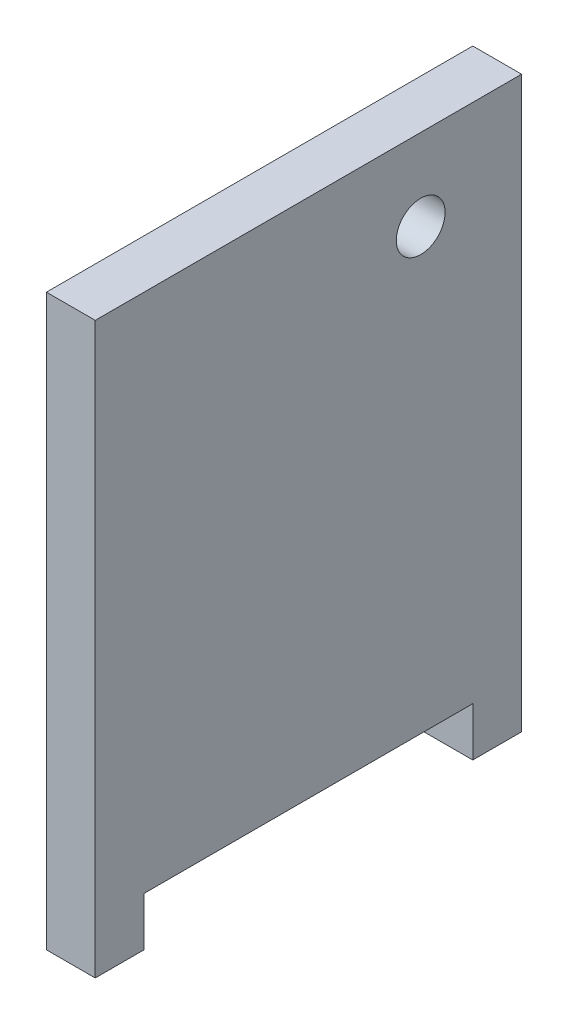
ISO-10303-21;
HEADER;
FILE_DESCRIPTION(('STEP AP214'),'2;1');
FILE_NAME('part.step','',(''),(''),'','','');
FILE_SCHEMA(('AUTOMOTIVE_DESIGN { 1 0 10303 214 1 1 1 1 }'));
ENDSEC;
DATA;
#1=APPLICATION_CONTEXT('core data for automotive mechanical design processes');
#2=APPLICATION_PROTOCOL_DEFINITION('international standard','automotive_design',2000,#1);
#3=PRODUCT_CONTEXT('',#1,'mechanical');
#4=PRODUCT('Part','Part','',(#3));
#5=PRODUCT_RELATED_PRODUCT_CATEGORY('part','',(#4));
#6=PRODUCT_DEFINITION_FORMATION('','',#4);
#7=PRODUCT_DEFINITION_CONTEXT('part definition',#1,'design');
#8=PRODUCT_DEFINITION('design','',#6,#7);
#9=PRODUCT_DEFINITION_SHAPE('','',#8);
#10=(LENGTH_UNIT() NAMED_UNIT(*) SI_UNIT(.MILLI.,.METRE.));
#11=(NAMED_UNIT(*) PLANE_ANGLE_UNIT() SI_UNIT($,.RADIAN.));
#12=(NAMED_UNIT(*) SI_UNIT($,.STERADIAN.) SOLID_ANGLE_UNIT());
#13=UNCERTAINTY_MEASURE_WITH_UNIT(LENGTH_MEASURE(1.E-05),#10,'distance_accuracy_value','');
#14=(GEOMETRIC_REPRESENTATION_CONTEXT(3) GLOBAL_UNCERTAINTY_ASSIGNED_CONTEXT((#13)) GLOBAL_UNIT_ASSIGNED_CONTEXT((#10,
#11,#12)) REPRESENTATION_CONTEXT('',''));
#15=CARTESIAN_POINT('',(0.,0.,0.));
#16=DIRECTION('',(0.,0.,1.));
#17=DIRECTION('',(1.,0.,0.));
#18=AXIS2_PLACEMENT_3D('',#15,#16,#17);
#19=CARTESIAN_POINT('',(-3.,-35.,26.2));
#20=DIRECTION('',(0.,0.,-1.));
#21=DIRECTION('',(0.,1.,0.));
#22=AXIS2_PLACEMENT_3D('',#19,#20,#21);
#23=PLANE('',#22);
#24=DIRECTION('',(0.,1.,0.));
#25=VECTOR('',#24,1.);
#26=CARTESIAN_POINT('',(0.,-35.,26.2));
#27=LINE('',#26,#25);
#28=CARTESIAN_POINT('',(0.,-35.,26.2));
#29=VERTEX_POINT('',#28);
#30=CARTESIAN_POINT('',(0.,0.,26.2));
#31=VERTEX_POINT('',#30);
#32=EDGE_CURVE('E123',#29,#31,#27,.T.);
#33=ORIENTED_EDGE('',*,*,#32,.T.);
#34=DIRECTION('',(1.,0.,0.));
#35=VECTOR('',#34,1.);
#36=CARTESIAN_POINT('',(-3.,0.,26.2));
#37=LINE('',#36,#35);
#38=CARTESIAN_POINT('',(-3.,0.,26.2));
#39=VERTEX_POINT('',#38);
#40=EDGE_CURVE('E10',#39,#31,#37,.T.);
#41=ORIENTED_EDGE('',*,*,#40,.F.);
#42=DIRECTION('',(0.,1.,0.));
#43=VECTOR('',#42,1.);
#44=CARTESIAN_POINT('',(-3.,-35.,26.2));
#45=LINE('',#44,#43);
#46=CARTESIAN_POINT('',(-3.,-35.,26.2));
#47=VERTEX_POINT('',#46);
#48=EDGE_CURVE('E113',#47,#39,#45,.T.);
#49=ORIENTED_EDGE('',*,*,#48,.F.);
#50=DIRECTION('',(1.,0.,0.));
#51=VECTOR('',#50,1.);
#52=CARTESIAN_POINT('',(-3.,-35.,26.2));
#53=LINE('',#52,#51);
#54=EDGE_CURVE('E118',#47,#29,#53,.T.);
#55=ORIENTED_EDGE('',*,*,#54,.T.);
#56=EDGE_LOOP('',(#33,#41,#49,#55));
#57=FACE_BOUND('',#56,.T.);
#58=ADVANCED_FACE('F16',(#57),#23,.F.);
#59=CARTESIAN_POINT('',(-3.,0.,26.2));
#60=DIRECTION('',(0.,-1.,0.));
#61=DIRECTION('',(0.,0.,-1.));
#62=AXIS2_PLACEMENT_3D('',#59,#60,#61);
#63=PLANE('',#62);
#64=DIRECTION('',(0.,0.,-1.));
#65=VECTOR('',#64,1.);
#66=CARTESIAN_POINT('',(0.,0.,26.2));
#67=LINE('',#66,#65);
#68=CARTESIAN_POINT('',(0.,0.,0.));
#69=VERTEX_POINT('',#68);
#70=EDGE_CURVE('E119',#31,#69,#67,.T.);
#71=ORIENTED_EDGE('',*,*,#70,.T.);
#72=DIRECTION('',(1.,0.,0.));
#73=VECTOR('',#72,1.);
#74=CARTESIAN_POINT('',(-3.,0.,0.));
#75=LINE('',#74,#73);
#76=CARTESIAN_POINT('',(-3.,0.,0.));
#77=VERTEX_POINT('',#76);
#78=EDGE_CURVE('E24',#77,#69,#75,.T.);
#79=ORIENTED_EDGE('',*,*,#78,.F.);
#80=DIRECTION('',(0.,0.,-1.));
#81=VECTOR('',#80,1.);
#82=CARTESIAN_POINT('',(-3.,0.,26.2));
#83=LINE('',#82,#81);
#84=EDGE_CURVE('E75',#39,#77,#83,.T.);
#85=ORIENTED_EDGE('',*,*,#84,.F.);
#86=ORIENTED_EDGE('',*,*,#40,.T.);
#87=EDGE_LOOP('',(#71,#79,#85,#86));
#88=FACE_BOUND('',#87,.T.);
#89=ADVANCED_FACE('F178',(#88),#63,.F.);
#90=CARTESIAN_POINT('',(-3.,0.,0.));
#91=DIRECTION('',(0.,0.,1.));
#92=DIRECTION('',(0.,-1.,0.));
#93=AXIS2_PLACEMENT_3D('',#90,#91,#92);
#94=PLANE('',#93);
#95=DIRECTION('',(0.,-1.,0.));
#96=VECTOR('',#95,1.);
#97=CARTESIAN_POINT('',(0.,0.,0.));
#98=LINE('',#97,#96);
#99=CARTESIAN_POINT('',(0.,-35.,0.));
#100=VERTEX_POINT('',#99);
#101=EDGE_CURVE('E122',#69,#100,#98,.T.);
#102=ORIENTED_EDGE('',*,*,#101,.T.);
#103=DIRECTION('',(1.,0.,0.));
#104=VECTOR('',#103,1.);
#105=CARTESIAN_POINT('',(-3.,-35.,0.));
#106=LINE('',#105,#104);
#107=CARTESIAN_POINT('',(-3.,-35.,0.));
#108=VERTEX_POINT('',#107);
#109=EDGE_CURVE('E150',#108,#100,#106,.T.);
#110=ORIENTED_EDGE('',*,*,#109,.F.);
#111=DIRECTION('',(0.,-1.,0.));
#112=VECTOR('',#111,1.);
#113=CARTESIAN_POINT('',(-3.,0.,0.));
#114=LINE('',#113,#112);
#115=EDGE_CURVE('E158',#77,#108,#114,.T.);
#116=ORIENTED_EDGE('',*,*,#115,.F.);
#117=ORIENTED_EDGE('',*,*,#78,.T.);
#118=EDGE_LOOP('',(#102,#110,#116,#117));
#119=FACE_BOUND('',#118,.T.);
#120=ADVANCED_FACE('F156',(#119),#94,.F.);
#121=CARTESIAN_POINT('',(-3.,-35.,0.));
#122=DIRECTION('',(0.,1.,0.));
#123=DIRECTION('',(0.,0.,1.));
#124=AXIS2_PLACEMENT_3D('',#121,#122,#123);
#125=PLANE('',#124);
#126=DIRECTION('',(0.,0.,1.));
#127=VECTOR('',#126,1.);
#128=CARTESIAN_POINT('',(0.,-35.,0.));
#129=LINE('',#128,#127);
#130=CARTESIAN_POINT('',(0.,-35.,3.));
#131=VERTEX_POINT('',#130);
#132=EDGE_CURVE('E126',#100,#131,#129,.T.);
#133=ORIENTED_EDGE('',*,*,#132,.T.);
#134=DIRECTION('',(1.,0.,0.));
#135=VECTOR('',#134,1.);
#136=CARTESIAN_POINT('',(-3.,-35.,3.));
#137=LINE('',#136,#135);
#138=CARTESIAN_POINT('',(-3.,-35.,3.));
#139=VERTEX_POINT('',#138);
#140=EDGE_CURVE('E147',#139,#131,#137,.T.);
#141=ORIENTED_EDGE('',*,*,#140,.F.);
#142=DIRECTION('',(0.,0.,1.));
#143=VECTOR('',#142,1.);
#144=CARTESIAN_POINT('',(-3.,-35.,0.));
#145=LINE('',#144,#143);
#146=EDGE_CURVE('E171',#108,#139,#145,.T.);
#147=ORIENTED_EDGE('',*,*,#146,.F.);
#148=ORIENTED_EDGE('',*,*,#109,.T.);
#149=EDGE_LOOP('',(#133,#141,#147,#148));
#150=FACE_BOUND('',#149,.T.);
#151=ADVANCED_FACE('F167',(#150),#125,.F.);
#152=CARTESIAN_POINT('',(-3.,-35.,3.));
#153=DIRECTION('',(0.,0.,-1.));
#154=DIRECTION('',(0.,1.,0.));
#155=AXIS2_PLACEMENT_3D('',#152,#153,#154);
#156=PLANE('',#155);
#157=DIRECTION('',(0.,1.,0.));
#158=VECTOR('',#157,1.);
#159=CARTESIAN_POINT('',(0.,-35.,3.));
#160=LINE('',#159,#158);
#161=CARTESIAN_POINT('',(0.,-32.,2.99999999999999));
#162=VERTEX_POINT('',#161);
#163=EDGE_CURVE('E129',#131,#162,#160,.T.);
#164=ORIENTED_EDGE('',*,*,#163,.T.);
#165=DIRECTION('',(1.,0.,0.));
#166=VECTOR('',#165,1.);
#167=CARTESIAN_POINT('',(-3.,-32.,2.99999999999999));
#168=LINE('',#167,#166);
#169=CARTESIAN_POINT('',(-3.,-32.,2.99999999999999));
#170=VERTEX_POINT('',#169);
#171=EDGE_CURVE('E104',#170,#162,#168,.T.);
#172=ORIENTED_EDGE('',*,*,#171,.F.);
#173=DIRECTION('',(0.,1.,0.));
#174=VECTOR('',#173,1.);
#175=CARTESIAN_POINT('',(-3.,-35.,3.));
#176=LINE('',#175,#174);
#177=EDGE_CURVE('E95',#139,#170,#176,.T.);
#178=ORIENTED_EDGE('',*,*,#177,.F.);
#179=ORIENTED_EDGE('',*,*,#140,.T.);
#180=EDGE_LOOP('',(#164,#172,#178,#179));
#181=FACE_BOUND('',#180,.T.);
#182=ADVANCED_FACE('F170',(#181),#156,.F.);
#183=CARTESIAN_POINT('',(-3.,-32.,2.99999999999999));
#184=DIRECTION('',(0.,1.,0.));
#185=DIRECTION('',(0.,0.,1.));
#186=AXIS2_PLACEMENT_3D('',#183,#184,#185);
#187=PLANE('',#186);
#188=DIRECTION('',(0.,0.,1.));
#189=VECTOR('',#188,1.);
#190=CARTESIAN_POINT('',(0.,-32.,2.99999999999999));
#191=LINE('',#190,#189);
#192=CARTESIAN_POINT('',(0.,-32.,23.2));
#193=VERTEX_POINT('',#192);
#194=EDGE_CURVE('E103',#162,#193,#191,.T.);
#195=ORIENTED_EDGE('',*,*,#194,.T.);
#196=DIRECTION('',(1.,0.,0.));
#197=VECTOR('',#196,1.);
#198=CARTESIAN_POINT('',(-3.,-32.,23.2));
#199=LINE('',#198,#197);
#200=CARTESIAN_POINT('',(-3.,-32.,23.2));
#201=VERTEX_POINT('',#200);
#202=EDGE_CURVE('E100',#201,#193,#199,.T.);
#203=ORIENTED_EDGE('',*,*,#202,.F.);
#204=DIRECTION('',(0.,0.,1.));
#205=VECTOR('',#204,1.);
#206=CARTESIAN_POINT('',(-3.,-32.,2.99999999999999));
#207=LINE('',#206,#205);
#208=EDGE_CURVE('E88',#170,#201,#207,.T.);
#209=ORIENTED_EDGE('',*,*,#208,.F.);
#210=ORIENTED_EDGE('',*,*,#171,.T.);
#211=EDGE_LOOP('',(#195,#203,#209,#210));
#212=FACE_BOUND('',#211,.T.);
#213=ADVANCED_FACE('F101',(#212),#187,.F.);
#214=CARTESIAN_POINT('',(-3.,-32.,23.2));
#215=DIRECTION('',(0.,0.,1.));
#216=DIRECTION('',(1.,0.,0.));
#217=AXIS2_PLACEMENT_3D('',#214,#215,#216);
#218=PLANE('',#217);
#219=DIRECTION('',(0.,-1.,0.));
#220=VECTOR('',#219,1.);
#221=CARTESIAN_POINT('',(0.,-32.,23.2));
#222=LINE('',#221,#220);
#223=CARTESIAN_POINT('',(0.,-35.,23.2));
#224=VERTEX_POINT('',#223);
#225=EDGE_CURVE('E61',#193,#224,#222,.T.);
#226=ORIENTED_EDGE('',*,*,#225,.T.);
#227=DIRECTION('',(1.,0.,0.));
#228=VECTOR('',#227,1.);
#229=CARTESIAN_POINT('',(-3.,-35.,23.2));
#230=LINE('',#229,#228);
#231=CARTESIAN_POINT('',(-3.,-35.,23.2));
#232=VERTEX_POINT('',#231);
#233=EDGE_CURVE('E105',#232,#224,#230,.T.);
#234=ORIENTED_EDGE('',*,*,#233,.F.);
#235=DIRECTION('',(0.,-1.,0.));
#236=VECTOR('',#235,1.);
#237=CARTESIAN_POINT('',(-3.,-32.,23.2));
#238=LINE('',#237,#236);
#239=EDGE_CURVE('E93',#201,#232,#238,.T.);
#240=ORIENTED_EDGE('',*,*,#239,.F.);
#241=ORIENTED_EDGE('',*,*,#202,.T.);
#242=EDGE_LOOP('',(#226,#234,#240,#241));
#243=FACE_BOUND('',#242,.T.);
#244=ADVANCED_FACE('F107',(#243),#218,.F.);
#245=CARTESIAN_POINT('',(-3.,-35.,23.2));
#246=DIRECTION('',(0.,1.,0.));
#247=DIRECTION('',(0.,0.,1.));
#248=AXIS2_PLACEMENT_3D('',#245,#246,#247);
#249=PLANE('',#248);
#250=DIRECTION('',(0.,0.,1.));
#251=VECTOR('',#250,1.);
#252=CARTESIAN_POINT('',(0.,-35.,23.2));
#253=LINE('',#252,#251);
#254=EDGE_CURVE('E67',#224,#29,#253,.T.);
#255=ORIENTED_EDGE('',*,*,#254,.T.);
#256=ORIENTED_EDGE('',*,*,#54,.F.);
#257=DIRECTION('',(0.,0.,1.));
#258=VECTOR('',#257,1.);
#259=CARTESIAN_POINT('',(-3.,-35.,23.2));
#260=LINE('',#259,#258);
#261=EDGE_CURVE('E32',#232,#47,#260,.T.);
#262=ORIENTED_EDGE('',*,*,#261,.F.);
#263=ORIENTED_EDGE('',*,*,#233,.T.);
#264=EDGE_LOOP('',(#255,#256,#262,#263));
#265=FACE_BOUND('',#264,.T.);
#266=ADVANCED_FACE('F195',(#265),#249,.F.);
#267=CARTESIAN_POINT('',(-3.,-5.,6.2));
#268=DIRECTION('',(1.,0.,0.));
#269=DIRECTION('',(0.,0.,-1.));
#270=AXIS2_PLACEMENT_3D('',#267,#268,#269);
#271=CYLINDRICAL_SURFACE('',#270,1.5);
#272=CARTESIAN_POINT('',(-3.,-5.,6.2));
#273=DIRECTION('',(1.,0.,0.));
#274=DIRECTION('',(0.,1.,0.));
#275=AXIS2_PLACEMENT_3D('',#272,#273,#274);
#276=CIRCLE('',#275,1.5);
#277=CARTESIAN_POINT('',(-3.,-3.5,6.2));
#278=VERTEX_POINT('',#277);
#279=EDGE_CURVE('E109',#278,#278,#276,.T.);
#280=ORIENTED_EDGE('',*,*,#279,.F.);
#281=EDGE_LOOP('',(#280));
#282=FACE_BOUND('',#281,.T.);
#283=CARTESIAN_POINT('',(0.,-5.,6.2));
#284=DIRECTION('',(1.,0.,0.));
#285=DIRECTION('',(0.,1.,0.));
#286=AXIS2_PLACEMENT_3D('',#283,#284,#285);
#287=CIRCLE('',#286,1.5);
#288=CARTESIAN_POINT('',(0.,-3.5,6.2));
#289=VERTEX_POINT('',#288);
#290=EDGE_CURVE('E115',#289,#289,#287,.T.);
#291=ORIENTED_EDGE('',*,*,#290,.T.);
#292=EDGE_LOOP('',(#291));
#293=FACE_BOUND('',#292,.T.);
#294=ADVANCED_FACE('F198',(#282,#293),#271,.F.);
#295=CARTESIAN_POINT('',(-3.,0.,0.));
#296=DIRECTION('',(-1.,0.,0.));
#297=DIRECTION('',(0.,-1.,0.));
#298=AXIS2_PLACEMENT_3D('',#295,#296,#297);
#299=PLANE('',#298);
#300=ORIENTED_EDGE('',*,*,#48,.T.);
#301=ORIENTED_EDGE('',*,*,#84,.T.);
#302=ORIENTED_EDGE('',*,*,#115,.T.);
#303=ORIENTED_EDGE('',*,*,#146,.T.);
#304=ORIENTED_EDGE('',*,*,#177,.T.);
#305=ORIENTED_EDGE('',*,*,#208,.T.);
#306=ORIENTED_EDGE('',*,*,#239,.T.);
#307=ORIENTED_EDGE('',*,*,#261,.T.);
#308=EDGE_LOOP('',(#300,#301,#302,#303,#304,#305,#306,#307));
#309=FACE_BOUND('',#308,.T.);
#310=ORIENTED_EDGE('',*,*,#279,.T.);
#311=EDGE_LOOP('',(#310));
#312=FACE_BOUND('',#311,.T.);
#313=ADVANCED_FACE('F90',(#309,#312),#299,.T.);
#314=CARTESIAN_POINT('',(0.,0.,0.));
#315=DIRECTION('',(-1.,0.,0.));
#316=DIRECTION('',(0.,-1.,0.));
#317=AXIS2_PLACEMENT_3D('',#314,#315,#316);
#318=PLANE('',#317);
#319=ORIENTED_EDGE('',*,*,#32,.F.);
#320=ORIENTED_EDGE('',*,*,#254,.F.);
#321=ORIENTED_EDGE('',*,*,#225,.F.);
#322=ORIENTED_EDGE('',*,*,#194,.F.);
#323=ORIENTED_EDGE('',*,*,#163,.F.);
#324=ORIENTED_EDGE('',*,*,#132,.F.);
#325=ORIENTED_EDGE('',*,*,#101,.F.);
#326=ORIENTED_EDGE('',*,*,#70,.F.);
#327=EDGE_LOOP('',(#319,#320,#321,#322,#323,#324,#325,#326));
#328=FACE_BOUND('',#327,.T.);
#329=ORIENTED_EDGE('',*,*,#290,.F.);
#330=EDGE_LOOP('',(#329));
#331=FACE_BOUND('',#330,.T.);
#332=ADVANCED_FACE('F162',(#328,#331),#318,.F.);
#333=CLOSED_SHELL('',(#58,#89,#120,#151,#182,#213,#244,#266,#294,#313,#332));
#334=MANIFOLD_SOLID_BREP('B1',#333);
#335=ADVANCED_BREP_SHAPE_REPRESENTATION('',(#18,#334),#14);
#336=SHAPE_DEFINITION_REPRESENTATION(#9,#335);
ENDSEC;
END-ISO-10303-21;
